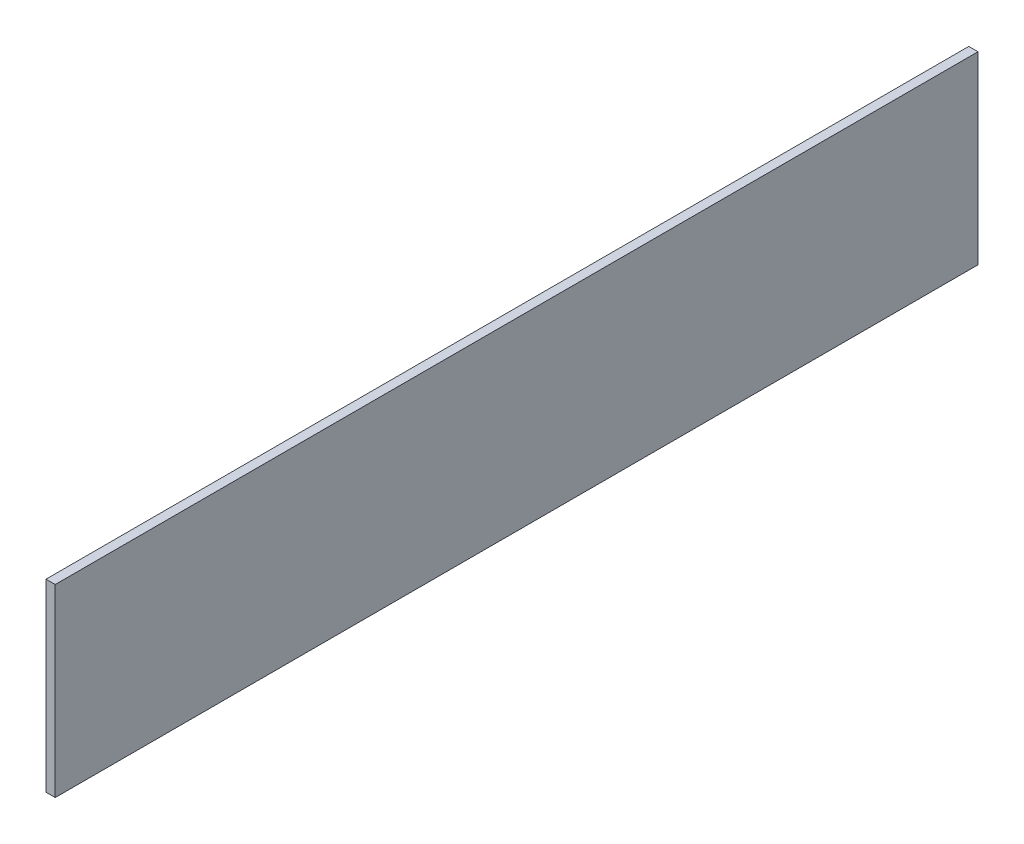
ISO-10303-21;
HEADER;
FILE_DESCRIPTION(('STEP AP214'),'2;1');
FILE_NAME('part.step','',(''),(''),'','','');
FILE_SCHEMA(('AUTOMOTIVE_DESIGN { 1 0 10303 214 1 1 1 1 }'));
ENDSEC;
DATA;
#1=APPLICATION_CONTEXT('core data for automotive mechanical design processes');
#2=APPLICATION_PROTOCOL_DEFINITION('international standard','automotive_design',2000,#1);
#3=PRODUCT_CONTEXT('',#1,'mechanical');
#4=PRODUCT('Part','Part','',(#3));
#5=PRODUCT_RELATED_PRODUCT_CATEGORY('part','',(#4));
#6=PRODUCT_DEFINITION_FORMATION('','',#4);
#7=PRODUCT_DEFINITION_CONTEXT('part definition',#1,'design');
#8=PRODUCT_DEFINITION('design','',#6,#7);
#9=PRODUCT_DEFINITION_SHAPE('','',#8);
#10=(LENGTH_UNIT() NAMED_UNIT(*) SI_UNIT(.MILLI.,.METRE.));
#11=(NAMED_UNIT(*) PLANE_ANGLE_UNIT() SI_UNIT($,.RADIAN.));
#12=(NAMED_UNIT(*) SI_UNIT($,.STERADIAN.) SOLID_ANGLE_UNIT());
#13=UNCERTAINTY_MEASURE_WITH_UNIT(LENGTH_MEASURE(1.E-05),#10,'distance_accuracy_value','');
#14=(GEOMETRIC_REPRESENTATION_CONTEXT(3) GLOBAL_UNCERTAINTY_ASSIGNED_CONTEXT((#13)) GLOBAL_UNIT_ASSIGNED_CONTEXT((#10,
#11,#12)) REPRESENTATION_CONTEXT('',''));
#15=CARTESIAN_POINT('',(0.,0.,0.));
#16=DIRECTION('',(0.,0.,1.));
#17=DIRECTION('',(1.,0.,0.));
#18=AXIS2_PLACEMENT_3D('',#15,#16,#17);
#19=CARTESIAN_POINT('',(2.,-20.,-100.));
#20=DIRECTION('',(0.,0.,1.));
#21=DIRECTION('',(1.,0.,0.));
#22=AXIS2_PLACEMENT_3D('',#19,#20,#21);
#23=PLANE('',#22);
#24=DIRECTION('',(0.,1.,0.));
#25=VECTOR('',#24,1.);
#26=CARTESIAN_POINT('',(0.,-20.,-100.));
#27=LINE('',#26,#25);
#28=CARTESIAN_POINT('',(0.,-20.,-100.));
#29=VERTEX_POINT('',#28);
#30=CARTESIAN_POINT('',(0.,20.,-100.));
#31=VERTEX_POINT('',#30);
#32=EDGE_CURVE('E100',#29,#31,#27,.T.);
#33=ORIENTED_EDGE('',*,*,#32,.T.);
#34=DIRECTION('',(-1.,0.,0.));
#35=VECTOR('',#34,1.);
#36=CARTESIAN_POINT('',(2.,20.,-100.));
#37=LINE('',#36,#35);
#38=CARTESIAN_POINT('',(2.,20.,-100.));
#39=VERTEX_POINT('',#38);
#40=EDGE_CURVE('E11',#39,#31,#37,.T.);
#41=ORIENTED_EDGE('',*,*,#40,.F.);
#42=DIRECTION('',(0.,1.,0.));
#43=VECTOR('',#42,1.);
#44=CARTESIAN_POINT('',(2.,-20.,-100.));
#45=LINE('',#44,#43);
#46=CARTESIAN_POINT('',(2.,-20.,-100.));
#47=VERTEX_POINT('',#46);
#48=EDGE_CURVE('E88',#47,#39,#45,.T.);
#49=ORIENTED_EDGE('',*,*,#48,.F.);
#50=DIRECTION('',(-1.,0.,0.));
#51=VECTOR('',#50,1.);
#52=CARTESIAN_POINT('',(2.,-20.,-100.));
#53=LINE('',#52,#51);
#54=EDGE_CURVE('E96',#47,#29,#53,.T.);
#55=ORIENTED_EDGE('',*,*,#54,.T.);
#56=EDGE_LOOP('',(#33,#41,#49,#55));
#57=FACE_BOUND('',#56,.T.);
#58=ADVANCED_FACE('F37',(#57),#23,.F.);
#59=CARTESIAN_POINT('',(2.,20.,100.));
#60=DIRECTION('',(0.,-1.,0.));
#61=DIRECTION('',(0.,0.,-1.));
#62=AXIS2_PLACEMENT_3D('',#59,#60,#61);
#63=PLANE('',#62);
#64=DIRECTION('',(0.,0.,1.));
#65=VECTOR('',#64,1.);
#66=CARTESIAN_POINT('',(0.,20.,100.));
#67=LINE('',#66,#65);
#68=CARTESIAN_POINT('',(0.,20.,100.));
#69=VERTEX_POINT('',#68);
#70=EDGE_CURVE('E92',#31,#69,#67,.T.);
#71=ORIENTED_EDGE('',*,*,#70,.T.);
#72=DIRECTION('',(-1.,0.,0.));
#73=VECTOR('',#72,1.);
#74=CARTESIAN_POINT('',(2.,20.,100.));
#75=LINE('',#74,#73);
#76=CARTESIAN_POINT('',(2.,20.,100.));
#77=VERTEX_POINT('',#76);
#78=EDGE_CURVE('E45',#77,#69,#75,.T.);
#79=ORIENTED_EDGE('',*,*,#78,.F.);
#80=DIRECTION('',(0.,0.,1.));
#81=VECTOR('',#80,1.);
#82=CARTESIAN_POINT('',(2.,20.,100.));
#83=LINE('',#82,#81);
#84=EDGE_CURVE('E83',#39,#77,#83,.T.);
#85=ORIENTED_EDGE('',*,*,#84,.F.);
#86=ORIENTED_EDGE('',*,*,#40,.T.);
#87=EDGE_LOOP('',(#71,#79,#85,#86));
#88=FACE_BOUND('',#87,.T.);
#89=ADVANCED_FACE('F91',(#88),#63,.F.);
#90=CARTESIAN_POINT('',(2.,-20.,100.));
#91=DIRECTION('',(0.,0.,-1.));
#92=DIRECTION('',(-1.,0.,0.));
#93=AXIS2_PLACEMENT_3D('',#90,#91,#92);
#94=PLANE('',#93);
#95=DIRECTION('',(0.,-1.,0.));
#96=VECTOR('',#95,1.);
#97=CARTESIAN_POINT('',(0.,-20.,100.));
#98=LINE('',#97,#96);
#99=CARTESIAN_POINT('',(0.,-20.,100.));
#100=VERTEX_POINT('',#99);
#101=EDGE_CURVE('E70',#69,#100,#98,.T.);
#102=ORIENTED_EDGE('',*,*,#101,.T.);
#103=DIRECTION('',(-1.,0.,0.));
#104=VECTOR('',#103,1.);
#105=CARTESIAN_POINT('',(2.,-20.,100.));
#106=LINE('',#105,#104);
#107=CARTESIAN_POINT('',(2.,-20.,100.));
#108=VERTEX_POINT('',#107);
#109=EDGE_CURVE('E93',#108,#100,#106,.T.);
#110=ORIENTED_EDGE('',*,*,#109,.F.);
#111=DIRECTION('',(0.,-1.,0.));
#112=VECTOR('',#111,1.);
#113=CARTESIAN_POINT('',(2.,-20.,100.));
#114=LINE('',#113,#112);
#115=EDGE_CURVE('E86',#77,#108,#114,.T.);
#116=ORIENTED_EDGE('',*,*,#115,.F.);
#117=ORIENTED_EDGE('',*,*,#78,.T.);
#118=EDGE_LOOP('',(#102,#110,#116,#117));
#119=FACE_BOUND('',#118,.T.);
#120=ADVANCED_FACE('F94',(#119),#94,.F.);
#121=CARTESIAN_POINT('',(2.,-20.,100.));
#122=DIRECTION('',(0.,1.,0.));
#123=DIRECTION('',(0.,0.,1.));
#124=AXIS2_PLACEMENT_3D('',#121,#122,#123);
#125=PLANE('',#124);
#126=DIRECTION('',(0.,0.,-1.));
#127=VECTOR('',#126,1.);
#128=CARTESIAN_POINT('',(0.,-20.,100.));
#129=LINE('',#128,#127);
#130=EDGE_CURVE('E76',#100,#29,#129,.T.);
#131=ORIENTED_EDGE('',*,*,#130,.T.);
#132=ORIENTED_EDGE('',*,*,#54,.F.);
#133=DIRECTION('',(0.,0.,-1.));
#134=VECTOR('',#133,1.);
#135=CARTESIAN_POINT('',(2.,-20.,100.));
#136=LINE('',#135,#134);
#137=EDGE_CURVE('E53',#108,#47,#136,.T.);
#138=ORIENTED_EDGE('',*,*,#137,.F.);
#139=ORIENTED_EDGE('',*,*,#109,.T.);
#140=EDGE_LOOP('',(#131,#132,#138,#139));
#141=FACE_BOUND('',#140,.T.);
#142=ADVANCED_FACE('F107',(#141),#125,.F.);
#143=CARTESIAN_POINT('',(2.,0.,0.));
#144=DIRECTION('',(-1.,0.,0.));
#145=DIRECTION('',(0.,0.,1.));
#146=AXIS2_PLACEMENT_3D('',#143,#144,#145);
#147=PLANE('',#146);
#148=ORIENTED_EDGE('',*,*,#48,.T.);
#149=ORIENTED_EDGE('',*,*,#84,.T.);
#150=ORIENTED_EDGE('',*,*,#115,.T.);
#151=ORIENTED_EDGE('',*,*,#137,.T.);
#152=EDGE_LOOP('',(#148,#149,#150,#151));
#153=FACE_BOUND('',#152,.T.);
#154=ADVANCED_FACE('F84',(#153),#147,.F.);
#155=CARTESIAN_POINT('',(0.,0.,0.));
#156=DIRECTION('',(-1.,0.,0.));
#157=DIRECTION('',(0.,0.,1.));
#158=AXIS2_PLACEMENT_3D('',#155,#156,#157);
#159=PLANE('',#158);
#160=ORIENTED_EDGE('',*,*,#32,.F.);
#161=ORIENTED_EDGE('',*,*,#130,.F.);
#162=ORIENTED_EDGE('',*,*,#101,.F.);
#163=ORIENTED_EDGE('',*,*,#70,.F.);
#164=EDGE_LOOP('',(#160,#161,#162,#163));
#165=FACE_BOUND('',#164,.T.);
#166=ADVANCED_FACE('F110',(#165),#159,.T.);
#167=CLOSED_SHELL('',(#58,#89,#120,#142,#154,#166));
#168=MANIFOLD_SOLID_BREP('B2',#167);
#169=ADVANCED_BREP_SHAPE_REPRESENTATION('',(#18,#168),#14);
#170=SHAPE_DEFINITION_REPRESENTATION(#9,#169);
ENDSEC;
END-ISO-10303-21;
